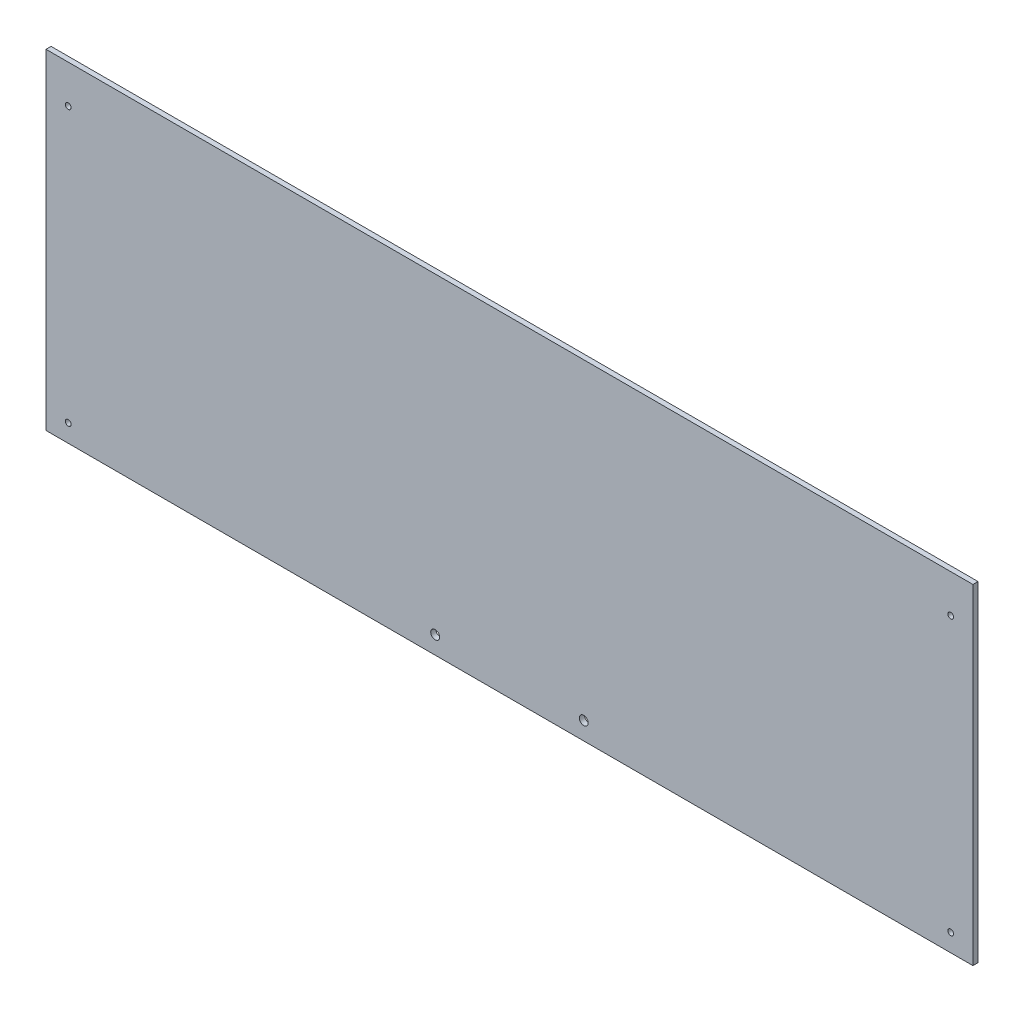
ISO-10303-21;
HEADER;
FILE_DESCRIPTION(('STEP AP214'),'2;1');
FILE_NAME('part.step','',(''),(''),'','','');
FILE_SCHEMA(('AUTOMOTIVE_DESIGN { 1 0 10303 214 1 1 1 1 }'));
ENDSEC;
DATA;
#1=APPLICATION_CONTEXT('core data for automotive mechanical design processes');
#2=APPLICATION_PROTOCOL_DEFINITION('international standard','automotive_design',2000,#1);
#3=PRODUCT_CONTEXT('',#1,'mechanical');
#4=PRODUCT('Part','Part','',(#3));
#5=PRODUCT_RELATED_PRODUCT_CATEGORY('part','',(#4));
#6=PRODUCT_DEFINITION_FORMATION('','',#4);
#7=PRODUCT_DEFINITION_CONTEXT('part definition',#1,'design');
#8=PRODUCT_DEFINITION('design','',#6,#7);
#9=PRODUCT_DEFINITION_SHAPE('','',#8);
#10=(LENGTH_UNIT() NAMED_UNIT(*) SI_UNIT(.MILLI.,.METRE.));
#11=(NAMED_UNIT(*) PLANE_ANGLE_UNIT() SI_UNIT($,.RADIAN.));
#12=(NAMED_UNIT(*) SI_UNIT($,.STERADIAN.) SOLID_ANGLE_UNIT());
#13=UNCERTAINTY_MEASURE_WITH_UNIT(LENGTH_MEASURE(1.E-05),#10,'distance_accuracy_value','');
#14=(GEOMETRIC_REPRESENTATION_CONTEXT(3) GLOBAL_UNCERTAINTY_ASSIGNED_CONTEXT((#13)) GLOBAL_UNIT_ASSIGNED_CONTEXT((#10,
#11,#12)) REPRESENTATION_CONTEXT('',''));
#15=CARTESIAN_POINT('',(0.,0.,0.));
#16=DIRECTION('',(0.,0.,1.));
#17=DIRECTION('',(1.,0.,0.));
#18=AXIS2_PLACEMENT_3D('',#15,#16,#17);
#19=CARTESIAN_POINT('',(-365.,0.,2.));
#20=DIRECTION('',(1.,0.,0.));
#21=DIRECTION('',(0.,1.,0.));
#22=AXIS2_PLACEMENT_3D('',#19,#20,#21);
#23=PLANE('',#22);
#24=DIRECTION('',(0.,-1.,0.));
#25=VECTOR('',#24,1.);
#26=CARTESIAN_POINT('',(-365.,0.,-2.));
#27=LINE('',#26,#25);
#28=CARTESIAN_POINT('',(-365.,0.,-2.));
#29=VERTEX_POINT('',#28);
#30=CARTESIAN_POINT('',(-365.,-260.,-2.));
#31=VERTEX_POINT('',#30);
#32=EDGE_CURVE('E99',#29,#31,#27,.T.);
#33=ORIENTED_EDGE('',*,*,#32,.T.);
#34=DIRECTION('',(0.,0.,-1.));
#35=VECTOR('',#34,1.);
#36=CARTESIAN_POINT('',(-365.,-260.,2.));
#37=LINE('',#36,#35);
#38=CARTESIAN_POINT('',(-365.,-260.,2.));
#39=VERTEX_POINT('',#38);
#40=EDGE_CURVE('E11',#39,#31,#37,.T.);
#41=ORIENTED_EDGE('',*,*,#40,.F.);
#42=DIRECTION('',(0.,-1.,0.));
#43=VECTOR('',#42,1.);
#44=CARTESIAN_POINT('',(-365.,0.,2.));
#45=LINE('',#44,#43);
#46=CARTESIAN_POINT('',(-365.,0.,2.));
#47=VERTEX_POINT('',#46);
#48=EDGE_CURVE('E87',#47,#39,#45,.T.);
#49=ORIENTED_EDGE('',*,*,#48,.F.);
#50=DIRECTION('',(0.,0.,-1.));
#51=VECTOR('',#50,1.);
#52=CARTESIAN_POINT('',(-365.,0.,2.));
#53=LINE('',#52,#51);
#54=EDGE_CURVE('E95',#47,#29,#53,.T.);
#55=ORIENTED_EDGE('',*,*,#54,.T.);
#56=EDGE_LOOP('',(#33,#41,#49,#55));
#57=FACE_BOUND('',#56,.T.);
#58=ADVANCED_FACE('F36',(#57),#23,.F.);
#59=CARTESIAN_POINT('',(-365.,-260.,2.));
#60=DIRECTION('',(0.,1.,0.));
#61=DIRECTION('',(0.,0.,1.));
#62=AXIS2_PLACEMENT_3D('',#59,#60,#61);
#63=PLANE('',#62);
#64=DIRECTION('',(1.,0.,0.));
#65=VECTOR('',#64,1.);
#66=CARTESIAN_POINT('',(-365.,-260.,-2.));
#67=LINE('',#66,#65);
#68=CARTESIAN_POINT('',(365.,-260.,-2.));
#69=VERTEX_POINT('',#68);
#70=EDGE_CURVE('E91',#31,#69,#67,.T.);
#71=ORIENTED_EDGE('',*,*,#70,.T.);
#72=DIRECTION('',(0.,0.,-1.));
#73=VECTOR('',#72,1.);
#74=CARTESIAN_POINT('',(365.,-260.,2.));
#75=LINE('',#74,#73);
#76=CARTESIAN_POINT('',(365.,-260.,2.));
#77=VERTEX_POINT('',#76);
#78=EDGE_CURVE('E44',#77,#69,#75,.T.);
#79=ORIENTED_EDGE('',*,*,#78,.F.);
#80=DIRECTION('',(1.,0.,0.));
#81=VECTOR('',#80,1.);
#82=CARTESIAN_POINT('',(-365.,-260.,2.));
#83=LINE('',#82,#81);
#84=EDGE_CURVE('E82',#39,#77,#83,.T.);
#85=ORIENTED_EDGE('',*,*,#84,.F.);
#86=ORIENTED_EDGE('',*,*,#40,.T.);
#87=EDGE_LOOP('',(#71,#79,#85,#86));
#88=FACE_BOUND('',#87,.T.);
#89=ADVANCED_FACE('F90',(#88),#63,.F.);
#90=CARTESIAN_POINT('',(365.,0.,2.));
#91=DIRECTION('',(-1.,0.,0.));
#92=DIRECTION('',(0.,-1.,0.));
#93=AXIS2_PLACEMENT_3D('',#90,#91,#92);
#94=PLANE('',#93);
#95=DIRECTION('',(0.,1.,0.));
#96=VECTOR('',#95,1.);
#97=CARTESIAN_POINT('',(365.,0.,-2.));
#98=LINE('',#97,#96);
#99=CARTESIAN_POINT('',(365.,0.,-2.));
#100=VERTEX_POINT('',#99);
#101=EDGE_CURVE('E69',#69,#100,#98,.T.);
#102=ORIENTED_EDGE('',*,*,#101,.T.);
#103=DIRECTION('',(0.,0.,-1.));
#104=VECTOR('',#103,1.);
#105=CARTESIAN_POINT('',(365.,0.,2.));
#106=LINE('',#105,#104);
#107=CARTESIAN_POINT('',(365.,0.,2.));
#108=VERTEX_POINT('',#107);
#109=EDGE_CURVE('E92',#108,#100,#106,.T.);
#110=ORIENTED_EDGE('',*,*,#109,.F.);
#111=DIRECTION('',(0.,1.,0.));
#112=VECTOR('',#111,1.);
#113=CARTESIAN_POINT('',(365.,0.,2.));
#114=LINE('',#113,#112);
#115=EDGE_CURVE('E85',#77,#108,#114,.T.);
#116=ORIENTED_EDGE('',*,*,#115,.F.);
#117=ORIENTED_EDGE('',*,*,#78,.T.);
#118=EDGE_LOOP('',(#102,#110,#116,#117));
#119=FACE_BOUND('',#118,.T.);
#120=ADVANCED_FACE('F93',(#119),#94,.F.);
#121=CARTESIAN_POINT('',(-365.,0.,2.));
#122=DIRECTION('',(0.,-1.,0.));
#123=DIRECTION('',(0.,0.,-1.));
#124=AXIS2_PLACEMENT_3D('',#121,#122,#123);
#125=PLANE('',#124);
#126=DIRECTION('',(-1.,0.,0.));
#127=VECTOR('',#126,1.);
#128=CARTESIAN_POINT('',(-365.,0.,-2.));
#129=LINE('',#128,#127);
#130=EDGE_CURVE('E75',#100,#29,#129,.T.);
#131=ORIENTED_EDGE('',*,*,#130,.T.);
#132=ORIENTED_EDGE('',*,*,#54,.F.);
#133=DIRECTION('',(-1.,0.,0.));
#134=VECTOR('',#133,1.);
#135=CARTESIAN_POINT('',(-365.,0.,2.));
#136=LINE('',#135,#134);
#137=EDGE_CURVE('E52',#108,#47,#136,.T.);
#138=ORIENTED_EDGE('',*,*,#137,.F.);
#139=ORIENTED_EDGE('',*,*,#109,.T.);
#140=EDGE_LOOP('',(#131,#132,#138,#139));
#141=FACE_BOUND('',#140,.T.);
#142=ADVANCED_FACE('F107',(#141),#125,.F.);
#143=CARTESIAN_POINT('',(0.,0.,2.));
#144=DIRECTION('',(0.,0.,1.));
#145=DIRECTION('',(1.,0.,0.));
#146=AXIS2_PLACEMENT_3D('',#143,#144,#145);
#147=PLANE('',#146);
#148=CARTESIAN_POINT('',(347.5,-30.,2.));
#149=DIRECTION('',(0.,0.,1.));
#150=DIRECTION('',(-1.,0.,0.));
#151=AXIS2_PLACEMENT_3D('',#148,#149,#150);
#152=CIRCLE('',#151,2.24999999999995);
#153=CARTESIAN_POINT('',(345.25,-30.,2.));
#154=VERTEX_POINT('',#153);
#155=EDGE_CURVE('E143',#154,#154,#152,.T.);
#156=ORIENTED_EDGE('',*,*,#155,.F.);
#157=EDGE_LOOP('',(#156));
#158=FACE_BOUND('',#157,.T.);
#159=CARTESIAN_POINT('',(347.5,-246.,2.));
#160=DIRECTION('',(0.,0.,1.));
#161=DIRECTION('',(-1.,0.,0.));
#162=AXIS2_PLACEMENT_3D('',#159,#160,#161);
#163=CIRCLE('',#162,2.24999999999996);
#164=CARTESIAN_POINT('',(345.25,-246.,2.));
#165=VERTEX_POINT('',#164);
#166=EDGE_CURVE('E137',#165,#165,#163,.T.);
#167=ORIENTED_EDGE('',*,*,#166,.F.);
#168=EDGE_LOOP('',(#167));
#169=FACE_BOUND('',#168,.T.);
#170=CARTESIAN_POINT('',(58.5,-246.,2.));
#171=DIRECTION('',(0.,0.,1.));
#172=DIRECTION('',(-1.,0.,0.));
#173=AXIS2_PLACEMENT_3D('',#170,#171,#172);
#174=CIRCLE('',#173,3.50000000000001);
#175=CARTESIAN_POINT('',(55.,-246.,2.));
#176=VERTEX_POINT('',#175);
#177=EDGE_CURVE('E131',#176,#176,#174,.T.);
#178=ORIENTED_EDGE('',*,*,#177,.F.);
#179=EDGE_LOOP('',(#178));
#180=FACE_BOUND('',#179,.T.);
#181=CARTESIAN_POINT('',(-58.5,-246.,2.));
#182=DIRECTION('',(0.,0.,1.));
#183=DIRECTION('',(1.,0.,0.));
#184=AXIS2_PLACEMENT_3D('',#181,#182,#183);
#185=CIRCLE('',#184,3.50000000000001);
#186=CARTESIAN_POINT('',(-55.,-246.,2.));
#187=VERTEX_POINT('',#186);
#188=EDGE_CURVE('E125',#187,#187,#185,.T.);
#189=ORIENTED_EDGE('',*,*,#188,.F.);
#190=EDGE_LOOP('',(#189));
#191=FACE_BOUND('',#190,.T.);
#192=CARTESIAN_POINT('',(-347.5,-246.,2.));
#193=DIRECTION('',(0.,0.,1.));
#194=DIRECTION('',(1.,0.,0.));
#195=AXIS2_PLACEMENT_3D('',#192,#193,#194);
#196=CIRCLE('',#195,2.24999999999996);
#197=CARTESIAN_POINT('',(-345.25,-246.,2.));
#198=VERTEX_POINT('',#197);
#199=EDGE_CURVE('E119',#198,#198,#196,.T.);
#200=ORIENTED_EDGE('',*,*,#199,.F.);
#201=EDGE_LOOP('',(#200));
#202=FACE_BOUND('',#201,.T.);
#203=CARTESIAN_POINT('',(-347.5,-30.,2.));
#204=DIRECTION('',(0.,0.,1.));
#205=DIRECTION('',(1.,0.,0.));
#206=AXIS2_PLACEMENT_3D('',#203,#204,#205);
#207=CIRCLE('',#206,2.24999999999995);
#208=CARTESIAN_POINT('',(-345.25,-30.,2.));
#209=VERTEX_POINT('',#208);
#210=EDGE_CURVE('E113',#209,#209,#207,.T.);
#211=ORIENTED_EDGE('',*,*,#210,.F.);
#212=EDGE_LOOP('',(#211));
#213=FACE_BOUND('',#212,.T.);
#214=ORIENTED_EDGE('',*,*,#48,.T.);
#215=ORIENTED_EDGE('',*,*,#84,.T.);
#216=ORIENTED_EDGE('',*,*,#115,.T.);
#217=ORIENTED_EDGE('',*,*,#137,.T.);
#218=EDGE_LOOP('',(#214,#215,#216,#217));
#219=FACE_BOUND('',#218,.T.);
#220=ADVANCED_FACE('F83',(#158,#169,#180,#191,#202,#213,#219),#147,.T.);
#221=CARTESIAN_POINT('',(0.,0.,-2.));
#222=DIRECTION('',(0.,0.,1.));
#223=DIRECTION('',(1.,0.,0.));
#224=AXIS2_PLACEMENT_3D('',#221,#222,#223);
#225=PLANE('',#224);
#226=CARTESIAN_POINT('',(347.5,-30.,-2.));
#227=DIRECTION('',(0.,0.,1.));
#228=DIRECTION('',(-1.,0.,0.));
#229=AXIS2_PLACEMENT_3D('',#226,#227,#228);
#230=CIRCLE('',#229,2.24999999999995);
#231=CARTESIAN_POINT('',(345.25,-30.,-2.));
#232=VERTEX_POINT('',#231);
#233=EDGE_CURVE('E140',#232,#232,#230,.T.);
#234=ORIENTED_EDGE('',*,*,#233,.T.);
#235=EDGE_LOOP('',(#234));
#236=FACE_BOUND('',#235,.T.);
#237=CARTESIAN_POINT('',(347.5,-246.,-2.));
#238=DIRECTION('',(0.,0.,1.));
#239=DIRECTION('',(-1.,0.,0.));
#240=AXIS2_PLACEMENT_3D('',#237,#238,#239);
#241=CIRCLE('',#240,2.24999999999996);
#242=CARTESIAN_POINT('',(345.25,-246.,-2.));
#243=VERTEX_POINT('',#242);
#244=EDGE_CURVE('E134',#243,#243,#241,.T.);
#245=ORIENTED_EDGE('',*,*,#244,.T.);
#246=EDGE_LOOP('',(#245));
#247=FACE_BOUND('',#246,.T.);
#248=CARTESIAN_POINT('',(58.5,-246.,-2.));
#249=DIRECTION('',(0.,0.,1.));
#250=DIRECTION('',(-1.,0.,0.));
#251=AXIS2_PLACEMENT_3D('',#248,#249,#250);
#252=CIRCLE('',#251,3.50000000000001);
#253=CARTESIAN_POINT('',(55.,-246.,-2.));
#254=VERTEX_POINT('',#253);
#255=EDGE_CURVE('E128',#254,#254,#252,.T.);
#256=ORIENTED_EDGE('',*,*,#255,.T.);
#257=EDGE_LOOP('',(#256));
#258=FACE_BOUND('',#257,.T.);
#259=CARTESIAN_POINT('',(-58.5,-246.,-2.));
#260=DIRECTION('',(0.,0.,1.));
#261=DIRECTION('',(1.,0.,0.));
#262=AXIS2_PLACEMENT_3D('',#259,#260,#261);
#263=CIRCLE('',#262,3.50000000000001);
#264=CARTESIAN_POINT('',(-55.,-246.,-2.));
#265=VERTEX_POINT('',#264);
#266=EDGE_CURVE('E122',#265,#265,#263,.T.);
#267=ORIENTED_EDGE('',*,*,#266,.T.);
#268=EDGE_LOOP('',(#267));
#269=FACE_BOUND('',#268,.T.);
#270=CARTESIAN_POINT('',(-347.5,-246.,-2.));
#271=DIRECTION('',(0.,0.,1.));
#272=DIRECTION('',(1.,0.,0.));
#273=AXIS2_PLACEMENT_3D('',#270,#271,#272);
#274=CIRCLE('',#273,2.24999999999996);
#275=CARTESIAN_POINT('',(-345.25,-246.,-2.));
#276=VERTEX_POINT('',#275);
#277=EDGE_CURVE('E116',#276,#276,#274,.T.);
#278=ORIENTED_EDGE('',*,*,#277,.T.);
#279=EDGE_LOOP('',(#278));
#280=FACE_BOUND('',#279,.T.);
#281=CARTESIAN_POINT('',(-347.5,-30.,-2.));
#282=DIRECTION('',(0.,0.,1.));
#283=DIRECTION('',(1.,0.,0.));
#284=AXIS2_PLACEMENT_3D('',#281,#282,#283);
#285=CIRCLE('',#284,2.24999999999995);
#286=CARTESIAN_POINT('',(-345.25,-30.,-2.));
#287=VERTEX_POINT('',#286);
#288=EDGE_CURVE('E102',#287,#287,#285,.T.);
#289=ORIENTED_EDGE('',*,*,#288,.T.);
#290=EDGE_LOOP('',(#289));
#291=FACE_BOUND('',#290,.T.);
#292=ORIENTED_EDGE('',*,*,#32,.F.);
#293=ORIENTED_EDGE('',*,*,#130,.F.);
#294=ORIENTED_EDGE('',*,*,#101,.F.);
#295=ORIENTED_EDGE('',*,*,#70,.F.);
#296=EDGE_LOOP('',(#292,#293,#294,#295));
#297=FACE_BOUND('',#296,.T.);
#298=ADVANCED_FACE('F110',(#236,#247,#258,#269,#280,#291,#297),#225,.F.);
#299=CARTESIAN_POINT('',(-347.5,-30.,-2.));
#300=DIRECTION('',(0.,0.,1.));
#301=DIRECTION('',(1.,0.,0.));
#302=AXIS2_PLACEMENT_3D('',#299,#300,#301);
#303=CYLINDRICAL_SURFACE('',#302,2.24999999999995);
#304=ORIENTED_EDGE('',*,*,#288,.F.);
#305=EDGE_LOOP('',(#304));
#306=FACE_BOUND('',#305,.T.);
#307=ORIENTED_EDGE('',*,*,#210,.T.);
#308=EDGE_LOOP('',(#307));
#309=FACE_BOUND('',#308,.T.);
#310=ADVANCED_FACE('F171',(#306,#309),#303,.F.);
#311=CARTESIAN_POINT('',(-347.5,-246.,-2.));
#312=DIRECTION('',(0.,0.,1.));
#313=DIRECTION('',(1.,0.,0.));
#314=AXIS2_PLACEMENT_3D('',#311,#312,#313);
#315=CYLINDRICAL_SURFACE('',#314,2.24999999999996);
#316=ORIENTED_EDGE('',*,*,#277,.F.);
#317=EDGE_LOOP('',(#316));
#318=FACE_BOUND('',#317,.T.);
#319=ORIENTED_EDGE('',*,*,#199,.T.);
#320=EDGE_LOOP('',(#319));
#321=FACE_BOUND('',#320,.T.);
#322=ADVANCED_FACE('F173',(#318,#321),#315,.F.);
#323=CARTESIAN_POINT('',(-58.5,-246.,-2.));
#324=DIRECTION('',(0.,0.,1.));
#325=DIRECTION('',(1.,0.,0.));
#326=AXIS2_PLACEMENT_3D('',#323,#324,#325);
#327=CYLINDRICAL_SURFACE('',#326,3.50000000000001);
#328=ORIENTED_EDGE('',*,*,#266,.F.);
#329=EDGE_LOOP('',(#328));
#330=FACE_BOUND('',#329,.T.);
#331=ORIENTED_EDGE('',*,*,#188,.T.);
#332=EDGE_LOOP('',(#331));
#333=FACE_BOUND('',#332,.T.);
#334=ADVANCED_FACE('F180',(#330,#333),#327,.F.);
#335=CARTESIAN_POINT('',(58.5,-246.,-2.));
#336=DIRECTION('',(0.,0.,1.));
#337=DIRECTION('',(1.,0.,0.));
#338=AXIS2_PLACEMENT_3D('',#335,#336,#337);
#339=CYLINDRICAL_SURFACE('',#338,3.50000000000001);
#340=ORIENTED_EDGE('',*,*,#255,.F.);
#341=EDGE_LOOP('',(#340));
#342=FACE_BOUND('',#341,.T.);
#343=ORIENTED_EDGE('',*,*,#177,.T.);
#344=EDGE_LOOP('',(#343));
#345=FACE_BOUND('',#344,.T.);
#346=ADVANCED_FACE('F226',(#342,#345),#339,.F.);
#347=CARTESIAN_POINT('',(347.5,-246.,-2.));
#348=DIRECTION('',(0.,0.,1.));
#349=DIRECTION('',(1.,0.,0.));
#350=AXIS2_PLACEMENT_3D('',#347,#348,#349);
#351=CYLINDRICAL_SURFACE('',#350,2.24999999999996);
#352=ORIENTED_EDGE('',*,*,#244,.F.);
#353=EDGE_LOOP('',(#352));
#354=FACE_BOUND('',#353,.T.);
#355=ORIENTED_EDGE('',*,*,#166,.T.);
#356=EDGE_LOOP('',(#355));
#357=FACE_BOUND('',#356,.T.);
#358=ADVANCED_FACE('F154',(#354,#357),#351,.F.);
#359=CARTESIAN_POINT('',(347.5,-30.,-2.));
#360=DIRECTION('',(0.,0.,1.));
#361=DIRECTION('',(1.,0.,0.));
#362=AXIS2_PLACEMENT_3D('',#359,#360,#361);
#363=CYLINDRICAL_SURFACE('',#362,2.24999999999995);
#364=ORIENTED_EDGE('',*,*,#233,.F.);
#365=EDGE_LOOP('',(#364));
#366=FACE_BOUND('',#365,.T.);
#367=ORIENTED_EDGE('',*,*,#155,.T.);
#368=EDGE_LOOP('',(#367));
#369=FACE_BOUND('',#368,.T.);
#370=ADVANCED_FACE('F151',(#366,#369),#363,.F.);
#371=CLOSED_SHELL('',(#58,#89,#120,#142,#220,#298,#310,#322,#334,#346,#358,#370));
#372=MANIFOLD_SOLID_BREP('B2',#371);
#373=ADVANCED_BREP_SHAPE_REPRESENTATION('',(#18,#372),#14);
#374=SHAPE_DEFINITION_REPRESENTATION(#9,#373);
ENDSEC;
END-ISO-10303-21;
